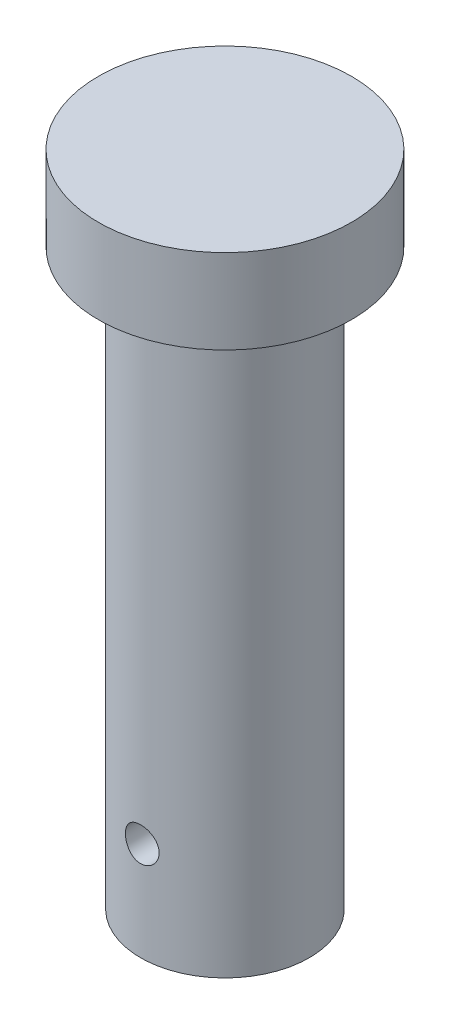
ISO-10303-21;
HEADER;
FILE_DESCRIPTION(('STEP AP214'),'2;1');
FILE_NAME('part.step','',(''),(''),'','','');
FILE_SCHEMA(('AUTOMOTIVE_DESIGN { 1 0 10303 214 1 1 1 1 }'));
ENDSEC;
DATA;
#1=APPLICATION_CONTEXT('core data for automotive mechanical design processes');
#2=APPLICATION_PROTOCOL_DEFINITION('international standard','automotive_design',2000,#1);
#3=PRODUCT_CONTEXT('',#1,'mechanical');
#4=PRODUCT('Part','Part','',(#3));
#5=PRODUCT_RELATED_PRODUCT_CATEGORY('part','',(#4));
#6=PRODUCT_DEFINITION_FORMATION('','',#4);
#7=PRODUCT_DEFINITION_CONTEXT('part definition',#1,'design');
#8=PRODUCT_DEFINITION('design','',#6,#7);
#9=PRODUCT_DEFINITION_SHAPE('','',#8);
#10=(LENGTH_UNIT() NAMED_UNIT(*) SI_UNIT(.MILLI.,.METRE.));
#11=(NAMED_UNIT(*) PLANE_ANGLE_UNIT() SI_UNIT($,.RADIAN.));
#12=(NAMED_UNIT(*) SI_UNIT($,.STERADIAN.) SOLID_ANGLE_UNIT());
#13=UNCERTAINTY_MEASURE_WITH_UNIT(LENGTH_MEASURE(1.E-05),#10,'distance_accuracy_value','');
#14=(GEOMETRIC_REPRESENTATION_CONTEXT(3) GLOBAL_UNCERTAINTY_ASSIGNED_CONTEXT((#13)) GLOBAL_UNIT_ASSIGNED_CONTEXT((#10,
#11,#12)) REPRESENTATION_CONTEXT('',''));
#15=CARTESIAN_POINT('',(0.,0.,0.));
#16=DIRECTION('',(0.,0.,1.));
#17=DIRECTION('',(1.,0.,0.));
#18=AXIS2_PLACEMENT_3D('',#15,#16,#17);
#19=CARTESIAN_POINT('',(15.,0.,0.));
#20=DIRECTION('',(0.,-1.,0.));
#21=DIRECTION('',(0.,0.,-1.));
#22=AXIS2_PLACEMENT_3D('',#19,#20,#21);
#23=PLANE('',#22);
#24=CARTESIAN_POINT('',(0.,0.,0.));
#25=DIRECTION('',(0.,-1.,0.));
#26=DIRECTION('',(0.,0.,-1.));
#27=AXIS2_PLACEMENT_3D('',#24,#25,#26);
#28=CIRCLE('',#27,15.);
#29=CARTESIAN_POINT('',(0.,0.,-15.));
#30=VERTEX_POINT('',#29);
#31=EDGE_CURVE('E96',#30,#30,#28,.T.);
#32=ORIENTED_EDGE('',*,*,#31,.T.);
#33=EDGE_LOOP('',(#32));
#34=FACE_BOUND('',#33,.T.);
#35=ADVANCED_FACE('F43',(#34),#23,.T.);
#36=CARTESIAN_POINT('',(0.,117.,0.));
#37=DIRECTION('',(0.,1.,0.));
#38=DIRECTION('',(0.,0.,1.));
#39=AXIS2_PLACEMENT_3D('',#36,#37,#38);
#40=PLANE('',#39);
#41=CARTESIAN_POINT('',(0.,117.,0.));
#42=DIRECTION('',(0.,-1.,0.));
#43=DIRECTION('',(0.,0.,-1.));
#44=AXIS2_PLACEMENT_3D('',#41,#42,#43);
#45=CIRCLE('',#44,22.5);
#46=CARTESIAN_POINT('',(0.,117.,-22.5));
#47=VERTEX_POINT('',#46);
#48=EDGE_CURVE('E10',#47,#47,#45,.T.);
#49=ORIENTED_EDGE('',*,*,#48,.F.);
#50=EDGE_LOOP('',(#49));
#51=FACE_BOUND('',#50,.T.);
#52=ADVANCED_FACE('F87',(#51),#40,.T.);
#53=CARTESIAN_POINT('',(0.,0.,0.));
#54=DIRECTION('',(0.,-1.,0.));
#55=DIRECTION('',(0.,0.,-1.));
#56=AXIS2_PLACEMENT_3D('',#53,#54,#55);
#57=CYLINDRICAL_SURFACE('',#56,22.5);
#58=ORIENTED_EDGE('',*,*,#48,.T.);
#59=EDGE_LOOP('',(#58));
#60=FACE_BOUND('',#59,.T.);
#61=CARTESIAN_POINT('',(0.,102.,0.));
#62=DIRECTION('',(0.,-1.,0.));
#63=DIRECTION('',(0.,0.,-1.));
#64=AXIS2_PLACEMENT_3D('',#61,#62,#63);
#65=CIRCLE('',#64,22.5);
#66=CARTESIAN_POINT('',(0.,102.,-22.5));
#67=VERTEX_POINT('',#66);
#68=EDGE_CURVE('E56',#67,#67,#65,.T.);
#69=ORIENTED_EDGE('',*,*,#68,.F.);
#70=EDGE_LOOP('',(#69));
#71=FACE_BOUND('',#70,.T.);
#72=ADVANCED_FACE('F92',(#60,#71),#57,.T.);
#73=CARTESIAN_POINT('',(22.5,102.,0.));
#74=DIRECTION('',(0.,-1.,0.));
#75=DIRECTION('',(0.,0.,-1.));
#76=AXIS2_PLACEMENT_3D('',#73,#74,#75);
#77=PLANE('',#76);
#78=ORIENTED_EDGE('',*,*,#68,.T.);
#79=EDGE_LOOP('',(#78));
#80=FACE_BOUND('',#79,.T.);
#81=CARTESIAN_POINT('',(0.,102.,0.));
#82=DIRECTION('',(0.,-1.,0.));
#83=DIRECTION('',(0.,0.,-1.));
#84=AXIS2_PLACEMENT_3D('',#81,#82,#83);
#85=CIRCLE('',#84,15.);
#86=CARTESIAN_POINT('',(0.,102.,-15.));
#87=VERTEX_POINT('',#86);
#88=EDGE_CURVE('E62',#87,#87,#85,.T.);
#89=ORIENTED_EDGE('',*,*,#88,.F.);
#90=EDGE_LOOP('',(#89));
#91=FACE_BOUND('',#90,.T.);
#92=ADVANCED_FACE('F82',(#80,#91),#77,.T.);
#93=CARTESIAN_POINT('',(0.,0.,0.));
#94=DIRECTION('',(0.,-1.,0.));
#95=DIRECTION('',(0.,0.,-1.));
#96=AXIS2_PLACEMENT_3D('',#93,#94,#95);
#97=CYLINDRICAL_SURFACE('',#96,15.);
#98=CARTESIAN_POINT('',(0.,20.5,-15.));
#99=CARTESIAN_POINT('',(0.166730720377899,20.499993866505,-14.9999969274261));
#100=CARTESIAN_POINT('',(0.333538980604567,20.4860534710971,-14.9971915553469));
#101=CARTESIAN_POINT('',(0.662440523067058,20.4307044996543,-14.9862709686969));
#102=CARTESIAN_POINT('',(0.824529952624067,20.3892741015955,-14.9781515358056));
#103=CARTESIAN_POINT('',(1.13919091578994,20.2802761791376,-14.9575094783486));
#104=CARTESIAN_POINT('',(1.2917714037994,20.2127336894659,-14.9449910723015));
#105=CARTESIAN_POINT('',(1.58342396659268,20.0535032574661,-14.9169119410594));
#106=CARTESIAN_POINT('',(1.72249684522743,19.9618167531784,-14.9013513970712));
#107=CARTESIAN_POINT('',(1.98508043194459,19.7555845171257,-14.8686649598991));
#108=CARTESIAN_POINT('',(2.10838185347557,19.6407749338264,-14.8515223651304));
#109=CARTESIAN_POINT('',(2.33411026982408,19.3921227508249,-14.8177254135776));
#110=CARTESIAN_POINT('',(2.43653563431127,19.2582786659946,-14.8010710950127));
#111=CARTESIAN_POINT('',(2.61849526004286,18.9738514209644,-14.7699732543784));
#112=CARTESIAN_POINT('',(2.6978128165976,18.8231270686109,-14.7555512209484));
#113=CARTESIAN_POINT('',(2.82991699974092,18.5101545429878,-14.7307880417525));
#114=CARTESIAN_POINT('',(2.88270624731171,18.347907509961,-14.7204464928588));
#115=CARTESIAN_POINT('',(2.95957589965448,18.0187469082762,-14.7051841575661));
#116=CARTESIAN_POINT('',(2.98402349387633,17.8519223675733,-14.7001941032156));
#117=CARTESIAN_POINT('',(3.00465638317836,17.516470535907,-14.6959912518188));
#118=CARTESIAN_POINT('',(3.0008445681405,17.3478434310396,-14.6967778640352));
#119=CARTESIAN_POINT('',(2.96536371930546,17.016259635937,-14.7039765344455));
#120=CARTESIAN_POINT('',(2.93411562073172,16.8532557831181,-14.7103035857629));
#121=CARTESIAN_POINT('',(2.84531365386915,16.534851770011,-14.7277363848));
#122=CARTESIAN_POINT('',(2.78775852930204,16.379451973243,-14.7388423607334));
#123=CARTESIAN_POINT('',(2.64757435102416,16.0794542148892,-14.7646685550122));
#124=CARTESIAN_POINT('',(2.56477845369634,15.9349363612925,-14.7794126944111));
#125=CARTESIAN_POINT('',(2.37658072371804,15.6616874500816,-14.8108385631919));
#126=CARTESIAN_POINT('',(2.27117629307049,15.5329582094465,-14.827520515151));
#127=CARTESIAN_POINT('',(2.03849980368175,15.2925117926292,-14.8613106372438));
#128=CARTESIAN_POINT('',(1.91086848363733,15.1811422964226,-14.8784210763271));
#129=CARTESIAN_POINT('',(1.63855507218603,14.9813384610963,-14.9108654614322));
#130=CARTESIAN_POINT('',(1.49387276213817,14.8929044161193,-14.9261993846692));
#131=CARTESIAN_POINT('',(1.19117816063676,14.7414174723221,-14.9534007048266));
#132=CARTESIAN_POINT('',(1.0331454587559,14.6784043190664,-14.9652626654481));
#133=CARTESIAN_POINT('',(0.708446929345995,14.5799185778843,-14.9841422696357));
#134=CARTESIAN_POINT('',(0.54178215021735,14.5444426537791,-14.9911605000159));
#135=CARTESIAN_POINT('',(0.207538216881453,14.5025306386172,-14.999480156006));
#136=CARTESIAN_POINT('',(0.0400209849767301,14.4956187413792,-15.0008752395741));
#137=CARTESIAN_POINT('',(-0.293774802578141,14.5097495768265,-14.9980515579031));
#138=CARTESIAN_POINT('',(-0.460053427331379,14.5307907380578,-14.9938331082434));
#139=CARTESIAN_POINT('',(-0.785116979839622,14.5998351206319,-14.9803149602405));
#140=CARTESIAN_POINT('',(-0.943955845019708,14.6475942054937,-14.9710612921262));
#141=CARTESIAN_POINT('',(-1.251370882499,14.7684519479674,-14.948506561831));
#142=CARTESIAN_POINT('',(-1.39994628491262,14.8415525040305,-14.9352051964268));
#143=CARTESIAN_POINT('',(-1.68462352105865,15.0120474719539,-14.9057973459988));
#144=CARTESIAN_POINT('',(-1.82055038025656,15.1097283431168,-14.8896585131115));
#145=CARTESIAN_POINT('',(-2.07425405735762,15.3262275736218,-14.8564420448965));
#146=CARTESIAN_POINT('',(-2.19202892679229,15.4450481991996,-14.8393643090516));
#147=CARTESIAN_POINT('',(-2.40792177232253,15.7026200556734,-14.8058791067089));
#148=CARTESIAN_POINT('',(-2.50571310734597,15.841647232664,-14.7894858069991));
#149=CARTESIAN_POINT('',(-2.67655626015362,16.13443408407,-14.7595257538858));
#150=CARTESIAN_POINT('',(-2.74960906776871,16.2881931687207,-14.7459588874003));
#151=CARTESIAN_POINT('',(-2.86845552474588,16.6053047384487,-14.7233022175315));
#152=CARTESIAN_POINT('',(-2.91439049937315,16.768602523631,-14.7141892461656));
#153=CARTESIAN_POINT('',(-2.97812595488159,17.1008003604727,-14.7014231037608));
#154=CARTESIAN_POINT('',(-2.99593010467534,17.269699678628,-14.6977692207333));
#155=CARTESIAN_POINT('',(-3.00276273260241,17.605026593633,-14.6963744889414));
#156=CARTESIAN_POINT('',(-2.99230736421269,17.771443446781,-14.698527575679));
#157=CARTESIAN_POINT('',(-2.94405691230018,18.1000949497151,-14.7082672045384));
#158=CARTESIAN_POINT('',(-2.90626204838789,18.2623296330844,-14.7158537030151));
#159=CARTESIAN_POINT('',(-2.80463570549686,18.5776831337216,-14.7355579265747));
#160=CARTESIAN_POINT('',(-2.74086752015203,18.7308230815072,-14.7476646305649));
#161=CARTESIAN_POINT('',(-2.58916393380481,19.0243111622033,-14.7750514492251));
#162=CARTESIAN_POINT('',(-2.50122650632465,19.1646582211754,-14.7903318299668));
#163=CARTESIAN_POINT('',(-2.30191774435924,19.4311467164509,-14.8226688156968));
#164=CARTESIAN_POINT('',(-2.19017366170554,19.5570062958028,-14.839751187291));
#165=CARTESIAN_POINT('',(-1.94719310703942,19.7883586165875,-14.8735824561586));
#166=CARTESIAN_POINT('',(-1.81595216146,19.8938466709518,-14.8903312758955));
#167=CARTESIAN_POINT('',(-1.53605288726474,20.0825039318393,-14.9218149716391));
#168=CARTESIAN_POINT('',(-1.3872266532895,20.1654280098401,-14.9365269365774));
#169=CARTESIAN_POINT('',(-1.0774990828222,20.3049583677898,-14.96205375255));
#170=CARTESIAN_POINT('',(-0.916608782589377,20.3615883685975,-14.9728721141585));
#171=CARTESIAN_POINT('',(-0.629464466771338,20.4359558441341,-14.9872911778611));
#172=CARTESIAN_POINT('',(-0.504844992041353,20.4599295811233,-14.9920290947535));
#173=CARTESIAN_POINT('',(-0.253498575630201,20.4919537370751,-14.9983846241968));
#174=CARTESIAN_POINT('',(-0.126771701245857,20.5000046635293,-15.0000023361946));
#175=CARTESIAN_POINT('',(0.,20.5,-15.));
#176=B_SPLINE_CURVE_WITH_KNOTS('',3,(#98,#99,#100,#101,#102,#103,#104,#105,#106,#107,#108,#109,
#110,#111,#112,#113,#114,#115,#116,#117,#118,#119,#120,#121,#122,#123,#124,#125,#126,#127,#128,
#129,#130,#131,#132,#133,#134,#135,#136,#137,#138,#139,#140,#141,#142,#143,#144,#145,#146,#147,
#148,#149,#150,#151,#152,#153,#154,#155,#156,#157,#158,#159,#160,#161,#162,#163,#164,#165,#166,
#167,#168,#169,#170,#171,#172,#173,#174,#175),.UNSPECIFIED.,.T.,.F.,(4,2,2,2,2,2,2,2,2,2,2,2,2,
2,2,2,2,2,2,2,2,2,2,2,2,2,2,2,2,2,2,2,2,2,2,2,2,2,4),(0.,0.499728391983775,0.999853952073968,
1.49950120575102,1.99911870669259,2.50479801033656,3.0105167902421,3.52083585017768,
4.03110448095592,4.53468555310762,5.03821512843675,5.53415181018835,6.03011217761189,
6.52942470610777,7.02879464249011,7.53714757474052,8.04550702619461,8.55465824562071,
9.06374777094108,9.56432207028795,10.064868229736,10.5609136185217,11.0569961764807,
11.5591519810008,12.0613616503779,12.5712188573768,13.081055661704,13.5882114309817,
14.0953010499124,14.593191677031,15.0910783047782,15.5877588375933,16.084481027456,
16.5896422871743,17.0949196359879,17.6054849002691,18.1155886655256,18.4955632586968,
18.8755257411299),.UNSPECIFIED.);
#177=CARTESIAN_POINT('',(0.,20.5,-15.));
#178=VERTEX_POINT('',#177);
#179=EDGE_CURVE('E46',#178,#178,#176,.T.);
#180=ORIENTED_EDGE('',*,*,#179,.F.);
#181=EDGE_LOOP('',(#180));
#182=FACE_BOUND('',#181,.T.);
#183=CARTESIAN_POINT('',(3.,17.5,14.6969384566991));
#184=CARTESIAN_POINT('',(2.99999383762581,17.6666931264735,14.6969417707994));
#185=CARTESIAN_POINT('',(2.98605951515443,17.83346387,14.699805248061));
#186=CARTESIAN_POINT('',(2.93073685074852,18.1622875154294,14.7109329391462));
#187=CARTESIAN_POINT('',(2.88932654121148,18.3243365339079,14.7192014743436));
#188=CARTESIAN_POINT('',(2.78038734785924,18.6389119100626,14.7401662116556));
#189=CARTESIAN_POINT('',(2.71288444245786,18.7914475645978,14.7528580086323));
#190=CARTESIAN_POINT('',(2.55374732301152,19.0830245340909,14.7812339844197));
#191=CARTESIAN_POINT('',(2.46211445580345,19.2220666016137,14.7969179962038));
#192=CARTESIAN_POINT('',(2.25593722696031,19.4846830115616,14.8297589908276));
#193=CARTESIAN_POINT('',(2.14111696773996,19.6080387636519,14.8469321351174));
#194=CARTESIAN_POINT('',(1.89242036706393,19.8338726007369,14.8806741690779));
#195=CARTESIAN_POINT('',(1.75854269093396,19.9363492222516,14.8972430163249));
#196=CARTESIAN_POINT('',(1.47408406777277,20.1183640528854,14.9280838925269));
#197=CARTESIAN_POINT('',(1.32336770301663,20.1976945414499,14.9423346432465));
#198=CARTESIAN_POINT('',(1.01041245116182,20.3298248111444,14.9667521065089));
#199=CARTESIAN_POINT('',(0.848174644261663,20.382627075703,14.9769192013236));
#200=CARTESIAN_POINT('',(0.519050319835487,20.4595215808589,14.9919096206525));
#201=CARTESIAN_POINT('',(0.352253217644446,20.483982932713,14.9968015886438));
#202=CARTESIAN_POINT('',(0.0168557053126124,20.5046528555149,15.0009276355081));
#203=CARTESIAN_POINT('',(-0.151744529495526,20.5008641489375,15.0001622595828));
#204=CARTESIAN_POINT('',(-0.483426002230762,20.4654214593533,14.9931130460555));
#205=CARTESIAN_POINT('',(-0.646551642895406,20.4341650684965,14.9869079509751));
#206=CARTESIAN_POINT('',(-0.9651948797409,20.3453049026233,14.9697653147822));
#207=CARTESIAN_POINT('',(-1.12071217124138,20.2877000734244,14.9588275843212));
#208=CARTESIAN_POINT('',(-1.42085838960266,20.1474098795582,14.9333188805987));
#209=CARTESIAN_POINT('',(-1.5654125224017,20.0645687466853,14.9187254452567));
#210=CARTESIAN_POINT('',(-1.83871513757926,19.8762727682902,14.8875140842136));
#211=CARTESIAN_POINT('',(-1.967461798575,19.7708153206885,14.8708959256567));
#212=CARTESIAN_POINT('',(-2.20785429316037,19.5380991336746,14.8371289309338));
#213=CARTESIAN_POINT('',(-2.31916294972089,19.4104924398112,14.8199758937255));
#214=CARTESIAN_POINT('',(-2.51885547953042,19.1382506726477,14.7873471479628));
#215=CARTESIAN_POINT('',(-2.60723891918325,18.9936152773504,14.7718714711364));
#216=CARTESIAN_POINT('',(-2.75868844440564,18.6909375045346,14.7443414241877));
#217=CARTESIAN_POINT('',(-2.82169994333313,18.532867097081,14.7322944469065));
#218=CARTESIAN_POINT('',(-2.92017102488274,18.208086028828,14.7130942896382));
#219=CARTESIAN_POINT('',(-2.95563419836993,18.0413764971428,14.7059404718528));
#220=CARTESIAN_POINT('',(-2.99749801810815,17.7071054260029,14.6974643780348));
#221=CARTESIAN_POINT('',(-3.00438557669374,17.539607277069,14.6960444117146));
#222=CARTESIAN_POINT('',(-2.99021288493222,17.205855330401,14.6989345706656));
#223=CARTESIAN_POINT('',(-2.96915421936733,17.0396014626434,14.7032443710116));
#224=CARTESIAN_POINT('',(-2.90010662422247,16.7146940791233,14.7170169748474));
#225=CARTESIAN_POINT('',(-2.8523778625179,16.5559829708927,14.7264299704349));
#226=CARTESIAN_POINT('',(-2.73162310592555,16.2488101629138,14.7493046805499));
#227=CARTESIAN_POINT('',(-2.65859502711953,16.1003493086928,14.7627667285881));
#228=CARTESIAN_POINT('',(-2.4882124266468,15.8157606701495,14.7924421788612));
#229=CARTESIAN_POINT('',(-2.39055323394826,15.6798188610975,14.8086891559471));
#230=CARTESIAN_POINT('',(-2.17408671663814,15.4260750639973,14.8420117147991));
#231=CARTESIAN_POINT('',(-2.05527721543361,15.3082749452522,14.8590873817145));
#232=CARTESIAN_POINT('',(-1.79769682049368,15.0923123224433,14.8924603760765));
#233=CARTESIAN_POINT('',(-1.65864749678889,14.99447903605,14.9087417312605));
#234=CARTESIAN_POINT('',(-1.36580368990427,14.8235623555013,14.9384138288586));
#235=CARTESIAN_POINT('',(-1.21200982630052,14.7504779219657,14.9518046926563));
#236=CARTESIAN_POINT('',(-0.894908042472041,14.6316133847601,14.974118821832));
#237=CARTESIAN_POINT('',(-0.731660020434238,14.5856784453212,14.9830673742781));
#238=CARTESIAN_POINT('',(-0.399568364039738,14.5219262570085,14.9955970781298));
#239=CARTESIAN_POINT('',(-0.230725406133639,14.504105621573,14.9991788759955));
#240=CARTESIAN_POINT('',(0.10461868171086,14.4972190571113,15.0005562136234));
#241=CARTESIAN_POINT('',(0.271109436424479,14.5076581586313,14.9984513564799));
#242=CARTESIAN_POINT('',(0.599913093946947,14.5559018516435,14.9889013068102));
#243=CARTESIAN_POINT('',(0.762226049261164,14.5937060990444,14.9814561814329));
#244=CARTESIAN_POINT('',(1.07775824923519,14.6953869762748,14.9620649509476));
#245=CARTESIAN_POINT('',(1.23099732972049,14.7592041343929,14.9501291174284));
#246=CARTESIAN_POINT('',(1.5246636605582,14.9110367239933,14.9230416637104));
#247=CARTESIAN_POINT('',(1.66508989730353,14.9990540677135,14.9078897894096));
#248=CARTESIAN_POINT('',(1.93159167031774,15.1984581611839,14.8757279747022));
#249=CARTESIAN_POINT('',(2.05739914834453,15.3101990091513,14.858692002537));
#250=CARTESIAN_POINT('',(2.28864785327552,15.5531507202963,14.8248366872359));
#251=CARTESIAN_POINT('',(2.39408424962674,15.6843661884398,14.8080173963616));
#252=CARTESIAN_POINT('',(2.58267665834994,15.9642379500713,14.7763002820179));
#253=CARTESIAN_POINT('',(2.66558044385427,16.1130668833638,14.7614251071368));
#254=CARTESIAN_POINT('',(2.80507214779868,16.4227983197803,14.7355571137924));
#255=CARTESIAN_POINT('',(2.86168393792249,16.5836897160616,14.7245607757495));
#256=CARTESIAN_POINT('',(2.93600741957297,16.8707873663286,14.7098904341353));
#257=CARTESIAN_POINT('',(2.95996169557105,16.9953562585419,14.7050635474382));
#258=CARTESIAN_POINT('',(2.99196005387913,17.2466018636534,14.6985863537725));
#259=CARTESIAN_POINT('',(3.00000468468793,17.3732785037334,14.6969359372925));
#260=CARTESIAN_POINT('',(3.,17.5,14.6969384566991));
#261=B_SPLINE_CURVE_WITH_KNOTS('',3,(#183,#184,#185,#186,#187,#188,#189,#190,#191,#192,#193,
#194,#195,#196,#197,#198,#199,#200,#201,#202,#203,#204,#205,#206,#207,#208,#209,#210,#211,#212,
#213,#214,#215,#216,#217,#218,#219,#220,#221,#222,#223,#224,#225,#226,#227,#228,#229,#230,#231,
#232,#233,#234,#235,#236,#237,#238,#239,#240,#241,#242,#243,#244,#245,#246,#247,#248,#249,#250,
#251,#252,#253,#254,#255,#256,#257,#258,#259,#260),.UNSPECIFIED.,.T.,.F.,(4,2,2,2,2,2,2,2,2,2,2,
2,2,2,2,2,2,2,2,2,2,2,2,2,2,2,2,2,2,2,2,2,2,2,2,2,2,2,4),(0.,0.49961539160828,0.999630717852887,
1.49914949382176,1.99864039457959,2.5044675764531,3.01033020106265,3.5206020131235,
4.03082604739679,4.53432746649241,5.03778036348745,5.53406368900612,6.0303668722125,
6.52979772666909,7.02928607310198,7.5374804028745,8.04568434368161,8.55497589518329,
9.06420105048074,9.5647127341378,10.0651960358526,10.5608802534996,11.0566053106319,
11.5587917932356,12.0610299861063,12.5709780520035,13.0809046989031,13.5878944073595,
14.0948230407488,14.5929305224406,15.0910317410027,15.5880005122635,16.0850085640405,
16.5900345607679,17.0951801666934,17.6057669573882,18.1158892527059,18.4957141091448,
18.8755258705644),.UNSPECIFIED.);
#262=CARTESIAN_POINT('',(3.,17.5,14.6969384566991));
#263=VERTEX_POINT('',#262);
#264=EDGE_CURVE('E65',#263,#263,#261,.T.);
#265=ORIENTED_EDGE('',*,*,#264,.F.);
#266=EDGE_LOOP('',(#265));
#267=FACE_BOUND('',#266,.T.);
#268=ORIENTED_EDGE('',*,*,#88,.T.);
#269=EDGE_LOOP('',(#268));
#270=FACE_BOUND('',#269,.T.);
#271=ORIENTED_EDGE('',*,*,#31,.F.);
#272=EDGE_LOOP('',(#271));
#273=FACE_BOUND('',#272,.T.);
#274=ADVANCED_FACE('F71',(#182,#267,#270,#273),#97,.T.);
#275=CARTESIAN_POINT('',(0.,17.5,-22.5));
#276=DIRECTION('',(0.,0.,1.));
#277=DIRECTION('',(1.,0.,0.));
#278=AXIS2_PLACEMENT_3D('',#275,#276,#277);
#279=CYLINDRICAL_SURFACE('',#278,3.);
#280=ORIENTED_EDGE('',*,*,#179,.T.);
#281=EDGE_LOOP('',(#280));
#282=FACE_BOUND('',#281,.T.);
#283=ORIENTED_EDGE('',*,*,#264,.T.);
#284=EDGE_LOOP('',(#283));
#285=FACE_BOUND('',#284,.T.);
#286=ADVANCED_FACE('F74',(#282,#285),#279,.F.);
#287=CLOSED_SHELL('',(#35,#52,#72,#92,#274,#286));
#288=MANIFOLD_SOLID_BREP('B2',#287);
#289=ADVANCED_BREP_SHAPE_REPRESENTATION('',(#18,#288),#14);
#290=SHAPE_DEFINITION_REPRESENTATION(#9,#289);
ENDSEC;
END-ISO-10303-21;
